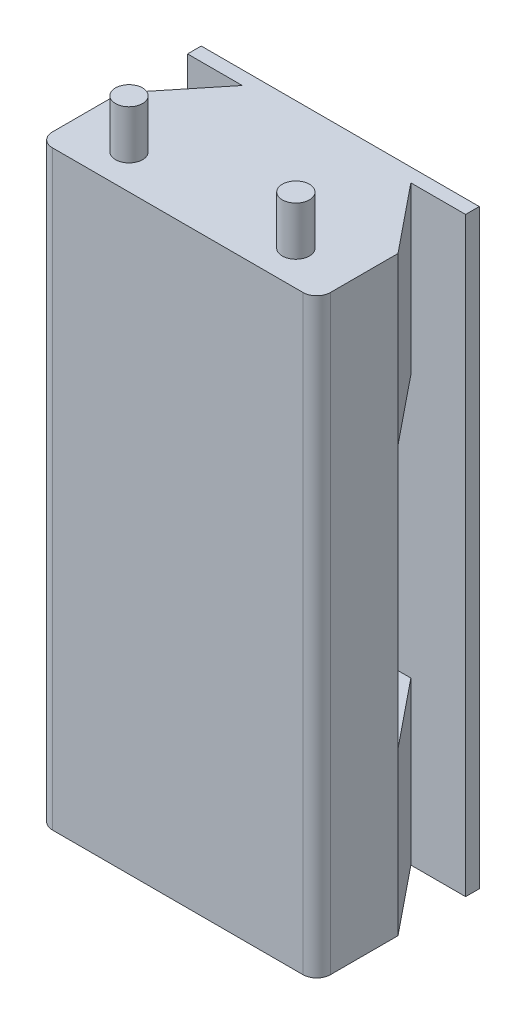
ISO-10303-21;
HEADER;
FILE_DESCRIPTION(('STEP AP214'),'2;1');
FILE_NAME('part.step','',(''),(''),'','','');
FILE_SCHEMA(('AUTOMOTIVE_DESIGN { 1 0 10303 214 1 1 1 1 }'));
ENDSEC;
DATA;
#1=APPLICATION_CONTEXT('core data for automotive mechanical design processes');
#2=APPLICATION_PROTOCOL_DEFINITION('international standard','automotive_design',2000,#1);
#3=PRODUCT_CONTEXT('',#1,'mechanical');
#4=PRODUCT('Part','Part','',(#3));
#5=PRODUCT_RELATED_PRODUCT_CATEGORY('part','',(#4));
#6=PRODUCT_DEFINITION_FORMATION('','',#4);
#7=PRODUCT_DEFINITION_CONTEXT('part definition',#1,'design');
#8=PRODUCT_DEFINITION('design','',#6,#7);
#9=PRODUCT_DEFINITION_SHAPE('','',#8);
#10=(LENGTH_UNIT() NAMED_UNIT(*) SI_UNIT(.MILLI.,.METRE.));
#11=(NAMED_UNIT(*) PLANE_ANGLE_UNIT() SI_UNIT($,.RADIAN.));
#12=(NAMED_UNIT(*) SI_UNIT($,.STERADIAN.) SOLID_ANGLE_UNIT());
#13=UNCERTAINTY_MEASURE_WITH_UNIT(LENGTH_MEASURE(1.E-05),#10,'distance_accuracy_value','');
#14=(GEOMETRIC_REPRESENTATION_CONTEXT(3) GLOBAL_UNCERTAINTY_ASSIGNED_CONTEXT((#13)) GLOBAL_UNIT_ASSIGNED_CONTEXT((#10,
#11,#12)) REPRESENTATION_CONTEXT('',''));
#15=CARTESIAN_POINT('',(0.,0.,0.));
#16=DIRECTION('',(0.,0.,1.));
#17=DIRECTION('',(1.,0.,0.));
#18=AXIS2_PLACEMENT_3D('',#15,#16,#17);
#19=CARTESIAN_POINT('',(56.2,-1.10000000000005,-54.4));
#20=DIRECTION('',(-0.777171592090801,0.,0.629288738535062));
#21=DIRECTION('',(0.629288738535062,0.,0.777171592090801));
#22=AXIS2_PLACEMENT_3D('',#19,#20,#21);
#23=PLANE('',#22);
#24=DIRECTION('',(0.,1.,0.));
#25=VECTOR('',#24,1.);
#26=CARTESIAN_POINT('',(56.2,-1.10000000000005,-54.4));
#27=LINE('',#26,#25);
#28=CARTESIAN_POINT('',(56.2,0.,-54.4));
#29=VERTEX_POINT('',#28);
#30=CARTESIAN_POINT('',(56.2,59.1992915055198,-54.4));
#31=VERTEX_POINT('',#30);
#32=EDGE_CURVE('E320',#29,#31,#27,.T.);
#33=ORIENTED_EDGE('',*,*,#32,.T.);
#34=DIRECTION('',(0.629288738535062,0.,0.777171592090801));
#35=VECTOR('',#34,1.);
#36=CARTESIAN_POINT('',(56.2,59.1992915055198,-54.4));
#37=LINE('',#36,#35);
#38=CARTESIAN_POINT('',(76.2,59.1992915055198,-29.7));
#39=VERTEX_POINT('',#38);
#40=EDGE_CURVE('E236',#31,#39,#37,.T.);
#41=ORIENTED_EDGE('',*,*,#40,.T.);
#42=DIRECTION('',(0.,1.,0.));
#43=VECTOR('',#42,1.);
#44=CARTESIAN_POINT('',(76.2,-1.10000000000005,-29.7));
#45=LINE('',#44,#43);
#46=CARTESIAN_POINT('',(76.2,0.,-29.7));
#47=VERTEX_POINT('',#46);
#48=EDGE_CURVE('E324',#47,#39,#45,.T.);
#49=ORIENTED_EDGE('',*,*,#48,.F.);
#50=DIRECTION('',(0.629288738535062,0.,0.777171592090801));
#51=VECTOR('',#50,1.);
#52=CARTESIAN_POINT('',(60.5497114118544,0.,-49.0281064063598));
#53=LINE('',#52,#51);
#54=EDGE_CURVE('E411',#29,#47,#53,.T.);
#55=ORIENTED_EDGE('',*,*,#54,.F.);
#56=EDGE_LOOP('',(#33,#41,#49,#55));
#57=FACE_BOUND('',#56,.T.);
#58=ADVANCED_FACE('F45',(#57),#23,.F.);
#59=CARTESIAN_POINT('',(-5.4,-1.10000000000005,-54.4));
#60=DIRECTION('',(0.777171592090801,0.,0.629288738535062));
#61=DIRECTION('',(0.629288738535062,0.,-0.777171592090801));
#62=AXIS2_PLACEMENT_3D('',#59,#60,#61);
#63=PLANE('',#62);
#64=DIRECTION('',(0.,1.,0.));
#65=VECTOR('',#64,1.);
#66=CARTESIAN_POINT('',(-25.4,-1.10000000000005,-29.7));
#67=LINE('',#66,#65);
#68=CARTESIAN_POINT('',(-25.4,0.,-29.7));
#69=VERTEX_POINT('',#68);
#70=CARTESIAN_POINT('',(-25.4,62.0129190338137,-29.7));
#71=VERTEX_POINT('',#70);
#72=EDGE_CURVE('E312',#69,#71,#67,.T.);
#73=ORIENTED_EDGE('',*,*,#72,.T.);
#74=DIRECTION('',(0.629288738535062,0.,-0.777171592090801));
#75=VECTOR('',#74,1.);
#76=CARTESIAN_POINT('',(-5.4,62.0129190338137,-54.4));
#77=LINE('',#76,#75);
#78=CARTESIAN_POINT('',(-5.39999999999999,62.0129190338137,-54.4));
#79=VERTEX_POINT('',#78);
#80=EDGE_CURVE('E11',#71,#79,#77,.T.);
#81=ORIENTED_EDGE('',*,*,#80,.T.);
#82=DIRECTION('',(0.,1.,0.));
#83=VECTOR('',#82,1.);
#84=CARTESIAN_POINT('',(-5.4,-1.10000000000005,-54.4));
#85=LINE('',#84,#83);
#86=CARTESIAN_POINT('',(-5.4,0.,-54.4));
#87=VERTEX_POINT('',#86);
#88=EDGE_CURVE('E307',#87,#79,#85,.T.);
#89=ORIENTED_EDGE('',*,*,#88,.F.);
#90=DIRECTION('',(0.629288738535062,0.,-0.777171592090801));
#91=VECTOR('',#90,1.);
#92=CARTESIAN_POINT('',(-29.8667306873645,0.,-24.1835876011048));
#93=LINE('',#92,#91);
#94=EDGE_CURVE('E415',#69,#87,#93,.T.);
#95=ORIENTED_EDGE('',*,*,#94,.F.);
#96=EDGE_LOOP('',(#73,#81,#89,#95));
#97=FACE_BOUND('',#96,.T.);
#98=ADVANCED_FACE('F565',(#97),#63,.F.);
#99=CARTESIAN_POINT('',(71.2,215.9,-5.));
#100=DIRECTION('',(0.,1.,0.));
#101=DIRECTION('',(0.,0.,1.));
#102=AXIS2_PLACEMENT_3D('',#99,#100,#101);
#103=CYLINDRICAL_SURFACE('',#102,5.);
#104=DIRECTION('',(0.,1.,0.));
#105=VECTOR('',#104,1.);
#106=CARTESIAN_POINT('',(71.2,215.9,0.));
#107=LINE('',#106,#105);
#108=CARTESIAN_POINT('',(71.2,0.,0.));
#109=VERTEX_POINT('',#108);
#110=CARTESIAN_POINT('',(71.2,215.9,0.));
#111=VERTEX_POINT('',#110);
#112=EDGE_CURVE('E437',#109,#111,#107,.T.);
#113=ORIENTED_EDGE('',*,*,#112,.F.);
#114=CARTESIAN_POINT('',(71.2,0.,-5.));
#115=DIRECTION('',(0.,1.,0.));
#116=DIRECTION('',(0.,0.,1.));
#117=AXIS2_PLACEMENT_3D('',#114,#115,#116);
#118=CIRCLE('',#117,5.);
#119=CARTESIAN_POINT('',(76.2,0.,-5.));
#120=VERTEX_POINT('',#119);
#121=EDGE_CURVE('E445',#120,#109,#118,.F.);
#122=ORIENTED_EDGE('',*,*,#121,.F.);
#123=DIRECTION('',(0.,1.,0.));
#124=VECTOR('',#123,1.);
#125=CARTESIAN_POINT('',(76.2,215.9,-5.));
#126=LINE('',#125,#124);
#127=CARTESIAN_POINT('',(76.2,215.9,-5.));
#128=VERTEX_POINT('',#127);
#129=EDGE_CURVE('E441',#128,#120,#126,.F.);
#130=ORIENTED_EDGE('',*,*,#129,.F.);
#131=CARTESIAN_POINT('',(71.2,215.9,-5.));
#132=DIRECTION('',(0.,1.,0.));
#133=DIRECTION('',(0.,0.,1.));
#134=AXIS2_PLACEMENT_3D('',#131,#132,#133);
#135=CIRCLE('',#134,5.);
#136=EDGE_CURVE('E448',#111,#128,#135,.T.);
#137=ORIENTED_EDGE('',*,*,#136,.F.);
#138=EDGE_LOOP('',(#113,#122,#130,#137));
#139=FACE_BOUND('',#138,.T.);
#140=ADVANCED_FACE('F47',(#139),#103,.T.);
#141=CARTESIAN_POINT('',(-20.4,215.9,-5.));
#142=DIRECTION('',(0.,1.,0.));
#143=DIRECTION('',(0.,0.,1.));
#144=AXIS2_PLACEMENT_3D('',#141,#142,#143);
#145=CYLINDRICAL_SURFACE('',#144,5.);
#146=DIRECTION('',(0.,1.,0.));
#147=VECTOR('',#146,1.);
#148=CARTESIAN_POINT('',(-25.4,215.9,-5.));
#149=LINE('',#148,#147);
#150=CARTESIAN_POINT('',(-25.4,0.,-5.));
#151=VERTEX_POINT('',#150);
#152=CARTESIAN_POINT('',(-25.4,215.9,-5.));
#153=VERTEX_POINT('',#152);
#154=EDGE_CURVE('E423',#151,#153,#149,.T.);
#155=ORIENTED_EDGE('',*,*,#154,.F.);
#156=CARTESIAN_POINT('',(-20.4,0.,-5.));
#157=DIRECTION('',(0.,1.,0.));
#158=DIRECTION('',(0.,0.,1.));
#159=AXIS2_PLACEMENT_3D('',#156,#157,#158);
#160=CIRCLE('',#159,5.);
#161=CARTESIAN_POINT('',(-20.4,0.,0.));
#162=VERTEX_POINT('',#161);
#163=EDGE_CURVE('E431',#162,#151,#160,.F.);
#164=ORIENTED_EDGE('',*,*,#163,.F.);
#165=DIRECTION('',(0.,1.,0.));
#166=VECTOR('',#165,1.);
#167=CARTESIAN_POINT('',(-20.4,215.9,0.));
#168=LINE('',#167,#166);
#169=CARTESIAN_POINT('',(-20.4,215.9,0.));
#170=VERTEX_POINT('',#169);
#171=EDGE_CURVE('E427',#170,#162,#168,.F.);
#172=ORIENTED_EDGE('',*,*,#171,.F.);
#173=CARTESIAN_POINT('',(-20.4,215.9,-5.));
#174=DIRECTION('',(0.,1.,0.));
#175=DIRECTION('',(0.,0.,1.));
#176=AXIS2_PLACEMENT_3D('',#173,#174,#175);
#177=CIRCLE('',#176,5.);
#178=EDGE_CURVE('E434',#153,#170,#177,.T.);
#179=ORIENTED_EDGE('',*,*,#178,.F.);
#180=EDGE_LOOP('',(#155,#164,#172,#179));
#181=FACE_BOUND('',#180,.T.);
#182=ADVANCED_FACE('F531',(#181),#145,.T.);
#183=CARTESIAN_POINT('',(76.2,215.9,-25.4));
#184=DIRECTION('',(-1.,0.,0.));
#185=DIRECTION('',(0.,0.,1.));
#186=AXIS2_PLACEMENT_3D('',#183,#184,#185);
#187=PLANE('',#186);
#188=DIRECTION('',(0.,0.,-1.));
#189=VECTOR('',#188,1.);
#190=CARTESIAN_POINT('',(76.2,215.9,-25.4));
#191=LINE('',#190,#189);
#192=CARTESIAN_POINT('',(76.2,215.9,-29.7));
#193=VERTEX_POINT('',#192);
#194=EDGE_CURVE('E381',#128,#193,#191,.T.);
#195=ORIENTED_EDGE('',*,*,#194,.F.);
#196=ORIENTED_EDGE('',*,*,#129,.T.);
#197=DIRECTION('',(0.,0.,-1.));
#198=VECTOR('',#197,1.);
#199=CARTESIAN_POINT('',(76.2,0.,-25.4));
#200=LINE('',#199,#198);
#201=EDGE_CURVE('E396',#120,#47,#200,.T.);
#202=ORIENTED_EDGE('',*,*,#201,.T.);
#203=ORIENTED_EDGE('',*,*,#48,.T.);
#204=DIRECTION('',(0.,-1.,0.));
#205=VECTOR('',#204,1.);
#206=CARTESIAN_POINT('',(76.2,155.19929150552,-29.7));
#207=LINE('',#206,#205);
#208=CARTESIAN_POINT('',(76.2,155.19929150552,-29.7));
#209=VERTEX_POINT('',#208);
#210=EDGE_CURVE('E212',#209,#39,#207,.T.);
#211=ORIENTED_EDGE('',*,*,#210,.F.);
#212=EDGE_CURVE('E292',#209,#193,#45,.T.);
#213=ORIENTED_EDGE('',*,*,#212,.T.);
#214=EDGE_LOOP('',(#195,#196,#202,#203,#211,#213));
#215=FACE_BOUND('',#214,.T.);
#216=ADVANCED_FACE('F546',(#215),#187,.F.);
#217=CARTESIAN_POINT('',(-25.4,215.9,0.));
#218=DIRECTION('',(1.,0.,0.));
#219=DIRECTION('',(0.,0.,-1.));
#220=AXIS2_PLACEMENT_3D('',#217,#218,#219);
#221=PLANE('',#220);
#222=DIRECTION('',(0.,0.,1.));
#223=VECTOR('',#222,1.);
#224=CARTESIAN_POINT('',(-25.4,0.,0.));
#225=LINE('',#224,#223);
#226=CARTESIAN_POINT('',(-25.4,0.,-59.4));
#227=VERTEX_POINT('',#226);
#228=CARTESIAN_POINT('',(-25.4,0.,-54.4));
#229=VERTEX_POINT('',#228);
#230=EDGE_CURVE('E400',#227,#229,#225,.T.);
#231=ORIENTED_EDGE('',*,*,#230,.T.);
#232=DIRECTION('',(0.,1.,0.));
#233=VECTOR('',#232,1.);
#234=CARTESIAN_POINT('',(-25.4,-1.10000000000005,-54.4));
#235=LINE('',#234,#233);
#236=CARTESIAN_POINT('',(-25.4,215.9,-54.4));
#237=VERTEX_POINT('',#236);
#238=EDGE_CURVE('E303',#229,#237,#235,.T.);
#239=ORIENTED_EDGE('',*,*,#238,.T.);
#240=DIRECTION('',(0.,0.,1.));
#241=VECTOR('',#240,1.);
#242=CARTESIAN_POINT('',(-25.4,215.9,0.));
#243=LINE('',#242,#241);
#244=CARTESIAN_POINT('',(-25.4,215.9,-59.4));
#245=VERTEX_POINT('',#244);
#246=EDGE_CURVE('E387',#245,#237,#243,.T.);
#247=ORIENTED_EDGE('',*,*,#246,.F.);
#248=DIRECTION('',(0.,1.,0.));
#249=VECTOR('',#248,1.);
#250=CARTESIAN_POINT('',(-25.4,0.,-59.4));
#251=LINE('',#250,#249);
#252=EDGE_CURVE('E340',#227,#245,#251,.T.);
#253=ORIENTED_EDGE('',*,*,#252,.F.);
#254=EDGE_LOOP('',(#231,#239,#247,#253));
#255=FACE_BOUND('',#254,.T.);
#256=ADVANCED_FACE('F514',(#255),#221,.F.);
#257=CARTESIAN_POINT('',(76.2,215.9,-54.4));
#258=VERTEX_POINT('',#257);
#259=CARTESIAN_POINT('',(76.2,215.9,-59.4));
#260=VERTEX_POINT('',#259);
#261=EDGE_CURVE('E386',#258,#260,#191,.T.);
#262=ORIENTED_EDGE('',*,*,#261,.F.);
#263=DIRECTION('',(0.,1.,0.));
#264=VECTOR('',#263,1.);
#265=CARTESIAN_POINT('',(76.2,-1.10000000000005,-54.4));
#266=LINE('',#265,#264);
#267=CARTESIAN_POINT('',(76.2,0.,-54.4));
#268=VERTEX_POINT('',#267);
#269=EDGE_CURVE('E316',#268,#258,#266,.T.);
#270=ORIENTED_EDGE('',*,*,#269,.F.);
#271=CARTESIAN_POINT('',(76.2,0.,-59.4));
#272=VERTEX_POINT('',#271);
#273=EDGE_CURVE('E369',#268,#272,#200,.T.);
#274=ORIENTED_EDGE('',*,*,#273,.T.);
#275=DIRECTION('',(0.,-1.,0.));
#276=VECTOR('',#275,1.);
#277=CARTESIAN_POINT('',(76.2,215.9,-59.4));
#278=LINE('',#277,#276);
#279=EDGE_CURVE('E306',#260,#272,#278,.T.);
#280=ORIENTED_EDGE('',*,*,#279,.F.);
#281=EDGE_LOOP('',(#262,#270,#274,#280));
#282=FACE_BOUND('',#281,.T.);
#283=ADVANCED_FACE('F505',(#282),#187,.F.);
#284=EDGE_CURVE('E399',#69,#151,#225,.T.);
#285=ORIENTED_EDGE('',*,*,#284,.T.);
#286=ORIENTED_EDGE('',*,*,#154,.T.);
#287=CARTESIAN_POINT('',(-25.4,215.9,-29.7));
#288=VERTEX_POINT('',#287);
#289=EDGE_CURVE('E385',#288,#153,#243,.T.);
#290=ORIENTED_EDGE('',*,*,#289,.F.);
#291=CARTESIAN_POINT('',(-25.4,158.012919033814,-29.7));
#292=VERTEX_POINT('',#291);
#293=EDGE_CURVE('E302',#292,#288,#67,.T.);
#294=ORIENTED_EDGE('',*,*,#293,.F.);
#295=DIRECTION('',(0.,1.,0.));
#296=VECTOR('',#295,1.);
#297=CARTESIAN_POINT('',(-25.4,158.012919033814,-29.7));
#298=LINE('',#297,#296);
#299=EDGE_CURVE('E240',#71,#292,#298,.T.);
#300=ORIENTED_EDGE('',*,*,#299,.F.);
#301=ORIENTED_EDGE('',*,*,#72,.F.);
#302=EDGE_LOOP('',(#285,#286,#290,#294,#300,#301));
#303=FACE_BOUND('',#302,.T.);
#304=ADVANCED_FACE('F466',(#303),#221,.F.);
#305=CARTESIAN_POINT('',(-25.4,215.9,0.));
#306=DIRECTION('',(0.,0.,-1.));
#307=DIRECTION('',(-1.,0.,0.));
#308=AXIS2_PLACEMENT_3D('',#305,#306,#307);
#309=PLANE('',#308);
#310=DIRECTION('',(1.,0.,0.));
#311=VECTOR('',#310,1.);
#312=CARTESIAN_POINT('',(-25.4,0.,0.));
#313=LINE('',#312,#311);
#314=EDGE_CURVE('E404',#162,#109,#313,.T.);
#315=ORIENTED_EDGE('',*,*,#314,.T.);
#316=ORIENTED_EDGE('',*,*,#112,.T.);
#317=DIRECTION('',(1.,0.,0.));
#318=VECTOR('',#317,1.);
#319=CARTESIAN_POINT('',(-25.4,215.9,0.));
#320=LINE('',#319,#318);
#321=EDGE_CURVE('E391',#170,#111,#320,.T.);
#322=ORIENTED_EDGE('',*,*,#321,.F.);
#323=ORIENTED_EDGE('',*,*,#171,.T.);
#324=EDGE_LOOP('',(#315,#316,#322,#323));
#325=FACE_BOUND('',#324,.T.);
#326=ADVANCED_FACE('F534',(#325),#309,.F.);
#327=CARTESIAN_POINT('',(0.,215.9,0.));
#328=DIRECTION('',(0.,1.,0.));
#329=DIRECTION('',(0.,0.,1.));
#330=AXIS2_PLACEMENT_3D('',#327,#328,#329);
#331=PLANE('',#330);
#332=ORIENTED_EDGE('',*,*,#321,.T.);
#333=ORIENTED_EDGE('',*,*,#136,.T.);
#334=ORIENTED_EDGE('',*,*,#194,.T.);
#335=DIRECTION('',(0.629288738535062,0.,0.777171592090801));
#336=VECTOR('',#335,1.);
#337=CARTESIAN_POINT('',(56.2,215.9,-54.4));
#338=LINE('',#337,#336);
#339=CARTESIAN_POINT('',(56.2,215.9,-54.4));
#340=VERTEX_POINT('',#339);
#341=EDGE_CURVE('E319',#340,#193,#338,.T.);
#342=ORIENTED_EDGE('',*,*,#341,.F.);
#343=DIRECTION('',(-1.,0.,0.));
#344=VECTOR('',#343,1.);
#345=CARTESIAN_POINT('',(76.2,215.9,-54.4));
#346=LINE('',#345,#344);
#347=EDGE_CURVE('E298',#258,#340,#346,.T.);
#348=ORIENTED_EDGE('',*,*,#347,.F.);
#349=ORIENTED_EDGE('',*,*,#261,.T.);
#350=DIRECTION('',(1.,0.,0.));
#351=VECTOR('',#350,1.);
#352=CARTESIAN_POINT('',(-25.4,215.9,-59.4));
#353=LINE('',#352,#351);
#354=EDGE_CURVE('E344',#245,#260,#353,.T.);
#355=ORIENTED_EDGE('',*,*,#354,.F.);
#356=ORIENTED_EDGE('',*,*,#246,.T.);
#357=DIRECTION('',(-1.,0.,0.));
#358=VECTOR('',#357,1.);
#359=CARTESIAN_POINT('',(-25.4,215.9,-54.4));
#360=LINE('',#359,#358);
#361=CARTESIAN_POINT('',(-5.4,215.9,-54.4));
#362=VERTEX_POINT('',#361);
#363=EDGE_CURVE('E297',#362,#237,#360,.T.);
#364=ORIENTED_EDGE('',*,*,#363,.F.);
#365=DIRECTION('',(0.629288738535062,0.,-0.777171592090801));
#366=VECTOR('',#365,1.);
#367=CARTESIAN_POINT('',(-5.4,215.9,-54.4));
#368=LINE('',#367,#366);
#369=EDGE_CURVE('E293',#288,#362,#368,.T.);
#370=ORIENTED_EDGE('',*,*,#369,.F.);
#371=ORIENTED_EDGE('',*,*,#289,.T.);
#372=ORIENTED_EDGE('',*,*,#178,.T.);
#373=EDGE_LOOP('',(#332,#333,#334,#342,#348,#349,#355,#356,#364,#370,#371,#372));
#374=FACE_BOUND('',#373,.T.);
#375=CARTESIAN_POINT('',(-5.08,215.9,-12.7));
#376=DIRECTION('',(0.,1.,0.));
#377=DIRECTION('',(0.,0.,1.));
#378=AXIS2_PLACEMENT_3D('',#375,#376,#377);
#379=CIRCLE('',#378,4.953);
#380=CARTESIAN_POINT('',(-5.08,215.9,-7.747));
#381=VERTEX_POINT('',#380);
#382=EDGE_CURVE('E354',#381,#381,#379,.T.);
#383=ORIENTED_EDGE('',*,*,#382,.F.);
#384=EDGE_LOOP('',(#383));
#385=FACE_BOUND('',#384,.T.);
#386=CARTESIAN_POINT('',(55.88,215.9,-12.7));
#387=DIRECTION('',(0.,1.,0.));
#388=DIRECTION('',(0.,0.,1.));
#389=AXIS2_PLACEMENT_3D('',#386,#387,#388);
#390=CIRCLE('',#389,4.953);
#391=CARTESIAN_POINT('',(55.88,215.9,-7.74700000000001));
#392=VERTEX_POINT('',#391);
#393=EDGE_CURVE('E358',#392,#392,#390,.T.);
#394=ORIENTED_EDGE('',*,*,#393,.F.);
#395=EDGE_LOOP('',(#394));
#396=FACE_BOUND('',#395,.T.);
#397=ADVANCED_FACE('F516',(#374,#385,#396),#331,.T.);
#398=CARTESIAN_POINT('',(0.,0.,0.));
#399=DIRECTION('',(0.,1.,0.));
#400=DIRECTION('',(0.,0.,1.));
#401=AXIS2_PLACEMENT_3D('',#398,#399,#400);
#402=PLANE('',#401);
#403=CARTESIAN_POINT('',(55.88,0.,-12.7));
#404=DIRECTION('',(0.,-1.,0.));
#405=DIRECTION('',(0.,0.,-1.));
#406=AXIS2_PLACEMENT_3D('',#403,#404,#405);
#407=CIRCLE('',#406,5.20700000000001);
#408=CARTESIAN_POINT('',(55.88,0.,-17.907));
#409=VERTEX_POINT('',#408);
#410=EDGE_CURVE('E370',#409,#409,#407,.T.);
#411=ORIENTED_EDGE('',*,*,#410,.F.);
#412=EDGE_LOOP('',(#411));
#413=FACE_BOUND('',#412,.T.);
#414=CARTESIAN_POINT('',(-5.08,0.,-12.7));
#415=DIRECTION('',(0.,-1.,0.));
#416=DIRECTION('',(0.,0.,-1.));
#417=AXIS2_PLACEMENT_3D('',#414,#415,#416);
#418=CIRCLE('',#417,5.207);
#419=CARTESIAN_POINT('',(-5.08,0.,-17.907));
#420=VERTEX_POINT('',#419);
#421=EDGE_CURVE('E374',#420,#420,#418,.T.);
#422=ORIENTED_EDGE('',*,*,#421,.F.);
#423=EDGE_LOOP('',(#422));
#424=FACE_BOUND('',#423,.T.);
#425=ORIENTED_EDGE('',*,*,#201,.F.);
#426=ORIENTED_EDGE('',*,*,#121,.T.);
#427=ORIENTED_EDGE('',*,*,#314,.F.);
#428=ORIENTED_EDGE('',*,*,#163,.T.);
#429=ORIENTED_EDGE('',*,*,#284,.F.);
#430=ORIENTED_EDGE('',*,*,#94,.T.);
#431=DIRECTION('',(-1.,0.,0.));
#432=VECTOR('',#431,1.);
#433=CARTESIAN_POINT('',(0.,0.,-54.4));
#434=LINE('',#433,#432);
#435=EDGE_CURVE('E419',#87,#229,#434,.T.);
#436=ORIENTED_EDGE('',*,*,#435,.T.);
#437=ORIENTED_EDGE('',*,*,#230,.F.);
#438=DIRECTION('',(-1.,0.,0.));
#439=VECTOR('',#438,1.);
#440=CARTESIAN_POINT('',(76.2,0.,-59.4));
#441=LINE('',#440,#439);
#442=EDGE_CURVE('E336',#272,#227,#441,.T.);
#443=ORIENTED_EDGE('',*,*,#442,.F.);
#444=ORIENTED_EDGE('',*,*,#273,.F.);
#445=DIRECTION('',(-1.,0.,0.));
#446=VECTOR('',#445,1.);
#447=CARTESIAN_POINT('',(0.,0.,-54.4));
#448=LINE('',#447,#446);
#449=EDGE_CURVE('E395',#268,#29,#448,.T.);
#450=ORIENTED_EDGE('',*,*,#449,.T.);
#451=ORIENTED_EDGE('',*,*,#54,.T.);
#452=EDGE_LOOP('',(#425,#426,#427,#428,#429,#430,#436,#437,#443,#444,#450,#451));
#453=FACE_BOUND('',#452,.T.);
#454=ADVANCED_FACE('F511',(#413,#424,#453),#402,.F.);
#455=CARTESIAN_POINT('',(-5.08,17.78,-12.7));
#456=DIRECTION('',(0.,-1.,0.));
#457=DIRECTION('',(0.,0.,-1.));
#458=AXIS2_PLACEMENT_3D('',#455,#456,#457);
#459=CYLINDRICAL_SURFACE('',#458,5.207);
#460=CARTESIAN_POINT('',(-5.08,17.78,-12.7));
#461=DIRECTION('',(0.,-1.,0.));
#462=DIRECTION('',(0.,0.,-1.));
#463=AXIS2_PLACEMENT_3D('',#460,#461,#462);
#464=CIRCLE('',#463,5.207);
#465=CARTESIAN_POINT('',(-5.08,17.78,-17.907));
#466=VERTEX_POINT('',#465);
#467=EDGE_CURVE('E353',#466,#466,#464,.T.);
#468=ORIENTED_EDGE('',*,*,#467,.F.);
#469=EDGE_LOOP('',(#468));
#470=FACE_BOUND('',#469,.T.);
#471=ORIENTED_EDGE('',*,*,#421,.T.);
#472=EDGE_LOOP('',(#471));
#473=FACE_BOUND('',#472,.T.);
#474=ADVANCED_FACE('F806',(#470,#473),#459,.F.);
#475=CARTESIAN_POINT('',(-5.08,17.78,-12.7));
#476=DIRECTION('',(0.,-1.,0.));
#477=DIRECTION('',(0.,0.,-1.));
#478=AXIS2_PLACEMENT_3D('',#475,#476,#477);
#479=PLANE('',#478);
#480=ORIENTED_EDGE('',*,*,#467,.T.);
#481=EDGE_LOOP('',(#480));
#482=FACE_BOUND('',#481,.T.);
#483=ADVANCED_FACE('F797',(#482),#479,.T.);
#484=CARTESIAN_POINT('',(55.88,17.78,-12.7));
#485=DIRECTION('',(0.,-1.,0.));
#486=DIRECTION('',(0.,0.,-1.));
#487=AXIS2_PLACEMENT_3D('',#484,#485,#486);
#488=CYLINDRICAL_SURFACE('',#487,5.20700000000001);
#489=CARTESIAN_POINT('',(55.88,17.78,-12.7));
#490=DIRECTION('',(0.,-1.,0.));
#491=DIRECTION('',(0.,0.,-1.));
#492=AXIS2_PLACEMENT_3D('',#489,#490,#491);
#493=CIRCLE('',#492,5.20700000000001);
#494=CARTESIAN_POINT('',(55.88,17.78,-17.907));
#495=VERTEX_POINT('',#494);
#496=EDGE_CURVE('E365',#495,#495,#493,.T.);
#497=ORIENTED_EDGE('',*,*,#496,.F.);
#498=EDGE_LOOP('',(#497));
#499=FACE_BOUND('',#498,.T.);
#500=ORIENTED_EDGE('',*,*,#410,.T.);
#501=EDGE_LOOP('',(#500));
#502=FACE_BOUND('',#501,.T.);
#503=ADVANCED_FACE('F788',(#499,#502),#488,.F.);
#504=CARTESIAN_POINT('',(55.88,17.78,-12.7));
#505=DIRECTION('',(0.,-1.,0.));
#506=DIRECTION('',(0.,0.,-1.));
#507=AXIS2_PLACEMENT_3D('',#504,#505,#506);
#508=PLANE('',#507);
#509=ORIENTED_EDGE('',*,*,#496,.T.);
#510=EDGE_LOOP('',(#509));
#511=FACE_BOUND('',#510,.T.);
#512=ADVANCED_FACE('F779',(#511),#508,.T.);
#513=CARTESIAN_POINT('',(55.88,233.68,-12.7));
#514=DIRECTION('',(0.,-1.,0.));
#515=DIRECTION('',(0.,0.,-1.));
#516=AXIS2_PLACEMENT_3D('',#513,#514,#515);
#517=CYLINDRICAL_SURFACE('',#516,4.953);
#518=CARTESIAN_POINT('',(55.88,233.68,-12.7));
#519=DIRECTION('',(0.,1.,0.));
#520=DIRECTION('',(0.,0.,1.));
#521=AXIS2_PLACEMENT_3D('',#518,#519,#520);
#522=CIRCLE('',#521,4.953);
#523=CARTESIAN_POINT('',(55.88,233.68,-7.74700000000001));
#524=VERTEX_POINT('',#523);
#525=EDGE_CURVE('E348',#524,#524,#522,.T.);
#526=ORIENTED_EDGE('',*,*,#525,.F.);
#527=EDGE_LOOP('',(#526));
#528=FACE_BOUND('',#527,.T.);
#529=ORIENTED_EDGE('',*,*,#393,.T.);
#530=EDGE_LOOP('',(#529));
#531=FACE_BOUND('',#530,.T.);
#532=ADVANCED_FACE('F770',(#528,#531),#517,.T.);
#533=CARTESIAN_POINT('',(55.88,233.68,-12.7));
#534=DIRECTION('',(0.,1.,0.));
#535=DIRECTION('',(0.,0.,1.));
#536=AXIS2_PLACEMENT_3D('',#533,#534,#535);
#537=PLANE('',#536);
#538=ORIENTED_EDGE('',*,*,#525,.T.);
#539=EDGE_LOOP('',(#538));
#540=FACE_BOUND('',#539,.T.);
#541=ADVANCED_FACE('F761',(#540),#537,.T.);
#542=CARTESIAN_POINT('',(-5.08,233.68,-12.7));
#543=DIRECTION('',(0.,-1.,0.));
#544=DIRECTION('',(0.,0.,-1.));
#545=AXIS2_PLACEMENT_3D('',#542,#543,#544);
#546=CYLINDRICAL_SURFACE('',#545,4.953);
#547=CARTESIAN_POINT('',(-5.08,233.68,-12.7));
#548=DIRECTION('',(0.,1.,0.));
#549=DIRECTION('',(0.,0.,1.));
#550=AXIS2_PLACEMENT_3D('',#547,#548,#549);
#551=CIRCLE('',#550,4.953);
#552=CARTESIAN_POINT('',(-5.08,233.68,-7.747));
#553=VERTEX_POINT('',#552);
#554=EDGE_CURVE('E349',#553,#553,#551,.T.);
#555=ORIENTED_EDGE('',*,*,#554,.F.);
#556=EDGE_LOOP('',(#555));
#557=FACE_BOUND('',#556,.T.);
#558=ORIENTED_EDGE('',*,*,#382,.T.);
#559=EDGE_LOOP('',(#558));
#560=FACE_BOUND('',#559,.T.);
#561=ADVANCED_FACE('F752',(#557,#560),#546,.T.);
#562=CARTESIAN_POINT('',(-5.08,233.68,-12.7));
#563=DIRECTION('',(0.,1.,0.));
#564=DIRECTION('',(0.,0.,1.));
#565=AXIS2_PLACEMENT_3D('',#562,#563,#564);
#566=PLANE('',#565);
#567=ORIENTED_EDGE('',*,*,#554,.T.);
#568=EDGE_LOOP('',(#567));
#569=FACE_BOUND('',#568,.T.);
#570=ADVANCED_FACE('F496',(#569),#566,.T.);
#571=CARTESIAN_POINT('',(0.,0.,-59.4));
#572=DIRECTION('',(0.,0.,-1.));
#573=DIRECTION('',(-1.,0.,0.));
#574=AXIS2_PLACEMENT_3D('',#571,#572,#573);
#575=PLANE('',#574);
#576=CARTESIAN_POINT('',(9.40000028272327,129.695762338146,-59.4));
#577=DIRECTION('',(0.,0.,-1.));
#578=DIRECTION('',(-1.,0.,0.));
#579=AXIS2_PLACEMENT_3D('',#576,#577,#578);
#580=CIRCLE('',#579,3.5);
#581=CARTESIAN_POINT('',(5.90000028272327,129.695762338146,-59.4));
#582=VERTEX_POINT('',#581);
#583=EDGE_CURVE('E281',#582,#582,#580,.T.);
#584=ORIENTED_EDGE('',*,*,#583,.F.);
#585=EDGE_LOOP('',(#584));
#586=FACE_BOUND('',#585,.T.);
#587=CARTESIAN_POINT('',(41.4000002827233,93.6957623381464,-59.4));
#588=DIRECTION('',(0.,0.,-1.));
#589=DIRECTION('',(-1.,0.,0.));
#590=AXIS2_PLACEMENT_3D('',#587,#588,#589);
#591=CIRCLE('',#590,3.5);
#592=CARTESIAN_POINT('',(37.9000002827232,93.6957623381464,-59.4));
#593=VERTEX_POINT('',#592);
#594=EDGE_CURVE('E280',#593,#593,#591,.T.);
#595=ORIENTED_EDGE('',*,*,#594,.F.);
#596=EDGE_LOOP('',(#595));
#597=FACE_BOUND('',#596,.T.);
#598=CARTESIAN_POINT('',(9.40000028272327,93.6957623381464,-59.4));
#599=DIRECTION('',(0.,0.,-1.));
#600=DIRECTION('',(-1.,0.,0.));
#601=AXIS2_PLACEMENT_3D('',#598,#599,#600);
#602=CIRCLE('',#601,3.5);
#603=CARTESIAN_POINT('',(5.90000028272326,93.6957623381464,-59.4));
#604=VERTEX_POINT('',#603);
#605=EDGE_CURVE('E276',#604,#604,#602,.T.);
#606=ORIENTED_EDGE('',*,*,#605,.F.);
#607=EDGE_LOOP('',(#606));
#608=FACE_BOUND('',#607,.T.);
#609=CARTESIAN_POINT('',(41.4000002827233,129.695762338146,-59.4));
#610=DIRECTION('',(0.,0.,-1.));
#611=DIRECTION('',(-1.,0.,0.));
#612=AXIS2_PLACEMENT_3D('',#609,#610,#611);
#613=CIRCLE('',#612,3.5);
#614=CARTESIAN_POINT('',(37.9000002827233,129.695762338146,-59.4));
#615=VERTEX_POINT('',#614);
#616=EDGE_CURVE('E285',#615,#615,#613,.T.);
#617=ORIENTED_EDGE('',*,*,#616,.F.);
#618=EDGE_LOOP('',(#617));
#619=FACE_BOUND('',#618,.T.);
#620=ORIENTED_EDGE('',*,*,#279,.T.);
#621=ORIENTED_EDGE('',*,*,#442,.T.);
#622=ORIENTED_EDGE('',*,*,#252,.T.);
#623=ORIENTED_EDGE('',*,*,#354,.T.);
#624=EDGE_LOOP('',(#620,#621,#622,#623));
#625=FACE_BOUND('',#624,.T.);
#626=ADVANCED_FACE('F493',(#586,#597,#608,#619,#625),#575,.T.);
#627=ORIENTED_EDGE('',*,*,#212,.F.);
#628=DIRECTION('',(-0.629288738535062,0.,-0.777171592090801));
#629=VECTOR('',#628,1.);
#630=CARTESIAN_POINT('',(56.2,155.19929150552,-54.4));
#631=LINE('',#630,#629);
#632=CARTESIAN_POINT('',(56.2,155.19929150552,-54.4));
#633=VERTEX_POINT('',#632);
#634=EDGE_CURVE('E233',#209,#633,#631,.T.);
#635=ORIENTED_EDGE('',*,*,#634,.T.);
#636=EDGE_CURVE('E195',#633,#340,#27,.T.);
#637=ORIENTED_EDGE('',*,*,#636,.T.);
#638=ORIENTED_EDGE('',*,*,#341,.T.);
#639=EDGE_LOOP('',(#627,#635,#637,#638));
#640=FACE_BOUND('',#639,.T.);
#641=ADVANCED_FACE('F482',(#640),#23,.F.);
#642=CARTESIAN_POINT('',(76.2,-1.10000000000005,-54.4));
#643=DIRECTION('',(0.,0.,-1.));
#644=DIRECTION('',(-1.,0.,0.));
#645=AXIS2_PLACEMENT_3D('',#642,#643,#644);
#646=PLANE('',#645);
#647=ORIENTED_EDGE('',*,*,#636,.F.);
#648=DIRECTION('',(1.,0.,0.));
#649=VECTOR('',#648,1.);
#650=CARTESIAN_POINT('',(34.2,155.19929150552,-54.4));
#651=LINE('',#650,#649);
#652=CARTESIAN_POINT('',(34.2,155.19929150552,-54.4));
#653=VERTEX_POINT('',#652);
#654=EDGE_CURVE('E186',#653,#633,#651,.T.);
#655=ORIENTED_EDGE('',*,*,#654,.F.);
#656=DIRECTION('',(0.,1.,0.));
#657=VECTOR('',#656,1.);
#658=CARTESIAN_POINT('',(34.2,59.1992915055198,-54.4));
#659=LINE('',#658,#657);
#660=CARTESIAN_POINT('',(34.2,59.1992915055198,-54.4));
#661=VERTEX_POINT('',#660);
#662=EDGE_CURVE('E192',#661,#653,#659,.T.);
#663=ORIENTED_EDGE('',*,*,#662,.F.);
#664=DIRECTION('',(1.,0.,0.));
#665=VECTOR('',#664,1.);
#666=CARTESIAN_POINT('',(34.2,59.1992915055198,-54.4));
#667=LINE('',#666,#665);
#668=EDGE_CURVE('E221',#661,#31,#667,.T.);
#669=ORIENTED_EDGE('',*,*,#668,.T.);
#670=ORIENTED_EDGE('',*,*,#32,.F.);
#671=ORIENTED_EDGE('',*,*,#449,.F.);
#672=ORIENTED_EDGE('',*,*,#269,.T.);
#673=ORIENTED_EDGE('',*,*,#347,.T.);
#674=EDGE_LOOP('',(#647,#655,#663,#669,#670,#671,#672,#673));
#675=FACE_BOUND('',#674,.T.);
#676=CARTESIAN_POINT('',(41.4000002827233,93.6957623381464,-54.4));
#677=DIRECTION('',(0.,0.,-1.));
#678=DIRECTION('',(0.,1.,0.));
#679=AXIS2_PLACEMENT_3D('',#676,#677,#678);
#680=CIRCLE('',#679,3.5);
#681=CARTESIAN_POINT('',(41.4000002827233,97.1957623381464,-54.4));
#682=VERTEX_POINT('',#681);
#683=EDGE_CURVE('E49',#682,#682,#680,.F.);
#684=ORIENTED_EDGE('',*,*,#683,.F.);
#685=EDGE_LOOP('',(#684));
#686=FACE_BOUND('',#685,.T.);
#687=CARTESIAN_POINT('',(41.4000002827233,129.695762338146,-54.4));
#688=DIRECTION('',(0.,0.,-1.));
#689=DIRECTION('',(0.,1.,0.));
#690=AXIS2_PLACEMENT_3D('',#687,#688,#689);
#691=CIRCLE('',#690,3.5);
#692=CARTESIAN_POINT('',(41.4000002827233,133.195762338146,-54.4));
#693=VERTEX_POINT('',#692);
#694=EDGE_CURVE('E229',#693,#693,#691,.F.);
#695=ORIENTED_EDGE('',*,*,#694,.F.);
#696=EDGE_LOOP('',(#695));
#697=FACE_BOUND('',#696,.T.);
#698=ADVANCED_FACE('F188',(#675,#686,#697),#646,.F.);
#699=CARTESIAN_POINT('',(-25.4,-1.10000000000005,-54.4));
#700=DIRECTION('',(0.,0.,-1.));
#701=DIRECTION('',(-1.,0.,0.));
#702=AXIS2_PLACEMENT_3D('',#699,#700,#701);
#703=PLANE('',#702);
#704=ORIENTED_EDGE('',*,*,#363,.T.);
#705=ORIENTED_EDGE('',*,*,#238,.F.);
#706=ORIENTED_EDGE('',*,*,#435,.F.);
#707=ORIENTED_EDGE('',*,*,#88,.T.);
#708=DIRECTION('',(-1.,0.,0.));
#709=VECTOR('',#708,1.);
#710=CARTESIAN_POINT('',(16.6,62.0129190338137,-54.4));
#711=LINE('',#710,#709);
#712=CARTESIAN_POINT('',(16.6,62.0129190338137,-54.4));
#713=VERTEX_POINT('',#712);
#714=EDGE_CURVE('E259',#713,#79,#711,.T.);
#715=ORIENTED_EDGE('',*,*,#714,.F.);
#716=DIRECTION('',(0.,-1.,0.));
#717=VECTOR('',#716,1.);
#718=CARTESIAN_POINT('',(16.6,158.012919033814,-54.4));
#719=LINE('',#718,#717);
#720=CARTESIAN_POINT('',(16.6,158.012919033814,-54.4));
#721=VERTEX_POINT('',#720);
#722=EDGE_CURVE('E253',#721,#713,#719,.T.);
#723=ORIENTED_EDGE('',*,*,#722,.F.);
#724=DIRECTION('',(-1.,0.,0.));
#725=VECTOR('',#724,1.);
#726=CARTESIAN_POINT('',(16.6,158.012919033814,-54.4));
#727=LINE('',#726,#725);
#728=CARTESIAN_POINT('',(-5.39999999999998,158.012919033814,-54.4));
#729=VERTEX_POINT('',#728);
#730=EDGE_CURVE('E263',#721,#729,#727,.T.);
#731=ORIENTED_EDGE('',*,*,#730,.T.);
#732=EDGE_CURVE('E311',#729,#362,#85,.T.);
#733=ORIENTED_EDGE('',*,*,#732,.T.);
#734=EDGE_LOOP('',(#704,#705,#706,#707,#715,#723,#731,#733));
#735=FACE_BOUND('',#734,.T.);
#736=CARTESIAN_POINT('',(9.40000028272327,129.695762338146,-54.4));
#737=DIRECTION('',(0.,0.,-1.));
#738=DIRECTION('',(0.,1.,0.));
#739=AXIS2_PLACEMENT_3D('',#736,#737,#738);
#740=CIRCLE('',#739,3.5);
#741=CARTESIAN_POINT('',(9.40000028272327,133.195762338146,-54.4));
#742=VERTEX_POINT('',#741);
#743=EDGE_CURVE('E262',#742,#742,#740,.F.);
#744=ORIENTED_EDGE('',*,*,#743,.F.);
#745=EDGE_LOOP('',(#744));
#746=FACE_BOUND('',#745,.T.);
#747=CARTESIAN_POINT('',(9.40000028272327,93.6957623381464,-54.4));
#748=DIRECTION('',(0.,0.,-1.));
#749=DIRECTION('',(0.,1.,0.));
#750=AXIS2_PLACEMENT_3D('',#747,#748,#749);
#751=CIRCLE('',#750,3.5);
#752=CARTESIAN_POINT('',(9.40000028272327,97.1957623381464,-54.4));
#753=VERTEX_POINT('',#752);
#754=EDGE_CURVE('E272',#753,#753,#751,.F.);
#755=ORIENTED_EDGE('',*,*,#754,.F.);
#756=EDGE_LOOP('',(#755));
#757=FACE_BOUND('',#756,.T.);
#758=ADVANCED_FACE('F481',(#735,#746,#757),#703,.F.);
#759=ORIENTED_EDGE('',*,*,#732,.F.);
#760=DIRECTION('',(-0.629288738535062,0.,0.777171592090801));
#761=VECTOR('',#760,1.);
#762=CARTESIAN_POINT('',(-5.4,158.012919033814,-54.4));
#763=LINE('',#762,#761);
#764=EDGE_CURVE('E55',#729,#292,#763,.T.);
#765=ORIENTED_EDGE('',*,*,#764,.T.);
#766=ORIENTED_EDGE('',*,*,#293,.T.);
#767=ORIENTED_EDGE('',*,*,#369,.T.);
#768=EDGE_LOOP('',(#759,#765,#766,#767));
#769=FACE_BOUND('',#768,.T.);
#770=ADVANCED_FACE('F459',(#769),#63,.F.);
#771=CARTESIAN_POINT('',(41.4000002827233,129.695762338146,-50.4));
#772=DIRECTION('',(0.,0.,-1.));
#773=DIRECTION('',(-1.,0.,0.));
#774=AXIS2_PLACEMENT_3D('',#771,#772,#773);
#775=CYLINDRICAL_SURFACE('',#774,3.5);
#776=ORIENTED_EDGE('',*,*,#694,.T.);
#777=EDGE_LOOP('',(#776));
#778=FACE_BOUND('',#777,.T.);
#779=ORIENTED_EDGE('',*,*,#616,.T.);
#780=EDGE_LOOP('',(#779));
#781=FACE_BOUND('',#780,.T.);
#782=ADVANCED_FACE('F486',(#778,#781),#775,.F.);
#783=CARTESIAN_POINT('',(9.40000028272327,93.6957623381464,-50.4));
#784=DIRECTION('',(0.,0.,-1.));
#785=DIRECTION('',(-1.,0.,0.));
#786=AXIS2_PLACEMENT_3D('',#783,#784,#785);
#787=CYLINDRICAL_SURFACE('',#786,3.5);
#788=ORIENTED_EDGE('',*,*,#754,.T.);
#789=EDGE_LOOP('',(#788));
#790=FACE_BOUND('',#789,.T.);
#791=ORIENTED_EDGE('',*,*,#605,.T.);
#792=EDGE_LOOP('',(#791));
#793=FACE_BOUND('',#792,.T.);
#794=ADVANCED_FACE('F489',(#790,#793),#787,.F.);
#795=CARTESIAN_POINT('',(41.4000002827233,93.6957623381464,-50.4));
#796=DIRECTION('',(0.,0.,-1.));
#797=DIRECTION('',(-1.,0.,0.));
#798=AXIS2_PLACEMENT_3D('',#795,#796,#797);
#799=CYLINDRICAL_SURFACE('',#798,3.5);
#800=ORIENTED_EDGE('',*,*,#683,.T.);
#801=EDGE_LOOP('',(#800));
#802=FACE_BOUND('',#801,.T.);
#803=ORIENTED_EDGE('',*,*,#594,.T.);
#804=EDGE_LOOP('',(#803));
#805=FACE_BOUND('',#804,.T.);
#806=ADVANCED_FACE('F477',(#802,#805),#799,.F.);
#807=CARTESIAN_POINT('',(9.40000028272327,129.695762338146,-50.4));
#808=DIRECTION('',(0.,0.,-1.));
#809=DIRECTION('',(-1.,0.,0.));
#810=AXIS2_PLACEMENT_3D('',#807,#808,#809);
#811=CYLINDRICAL_SURFACE('',#810,3.5);
#812=ORIENTED_EDGE('',*,*,#743,.T.);
#813=EDGE_LOOP('',(#812));
#814=FACE_BOUND('',#813,.T.);
#815=ORIENTED_EDGE('',*,*,#583,.T.);
#816=EDGE_LOOP('',(#815));
#817=FACE_BOUND('',#816,.T.);
#818=ADVANCED_FACE('F598',(#814,#817),#811,.F.);
#819=CARTESIAN_POINT('',(16.6,62.0129190338137,-54.4));
#820=DIRECTION('',(0.,-1.,0.));
#821=DIRECTION('',(0.,0.,-1.));
#822=AXIS2_PLACEMENT_3D('',#819,#820,#821);
#823=PLANE('',#822);
#824=DIRECTION('',(-1.,0.,0.));
#825=VECTOR('',#824,1.);
#826=CARTESIAN_POINT('',(16.6,62.0129190338137,-29.7));
#827=LINE('',#826,#825);
#828=CARTESIAN_POINT('',(16.6,62.0129190338137,-29.7));
#829=VERTEX_POINT('',#828);
#830=EDGE_CURVE('E70',#829,#71,#827,.T.);
#831=ORIENTED_EDGE('',*,*,#830,.F.);
#832=DIRECTION('',(0.,0.,1.));
#833=VECTOR('',#832,1.);
#834=CARTESIAN_POINT('',(16.6,62.0129190338137,-54.4));
#835=LINE('',#834,#833);
#836=EDGE_CURVE('E241',#713,#829,#835,.T.);
#837=ORIENTED_EDGE('',*,*,#836,.F.);
#838=ORIENTED_EDGE('',*,*,#714,.T.);
#839=ORIENTED_EDGE('',*,*,#80,.F.);
#840=EDGE_LOOP('',(#831,#837,#838,#839));
#841=FACE_BOUND('',#840,.T.);
#842=ADVANCED_FACE('F614',(#841),#823,.F.);
#843=CARTESIAN_POINT('',(16.6,158.012919033814,-29.7));
#844=DIRECTION('',(0.,1.,0.));
#845=DIRECTION('',(0.,0.,1.));
#846=AXIS2_PLACEMENT_3D('',#843,#844,#845);
#847=PLANE('',#846);
#848=ORIENTED_EDGE('',*,*,#730,.F.);
#849=DIRECTION('',(0.,0.,-1.));
#850=VECTOR('',#849,1.);
#851=CARTESIAN_POINT('',(16.6,158.012919033814,-29.7));
#852=LINE('',#851,#850);
#853=CARTESIAN_POINT('',(16.6,158.012919033814,-29.7));
#854=VERTEX_POINT('',#853);
#855=EDGE_CURVE('E249',#854,#721,#852,.T.);
#856=ORIENTED_EDGE('',*,*,#855,.F.);
#857=DIRECTION('',(-1.,0.,0.));
#858=VECTOR('',#857,1.);
#859=CARTESIAN_POINT('',(16.6,158.012919033814,-29.7));
#860=LINE('',#859,#858);
#861=EDGE_CURVE('E267',#854,#292,#860,.T.);
#862=ORIENTED_EDGE('',*,*,#861,.T.);
#863=ORIENTED_EDGE('',*,*,#764,.F.);
#864=EDGE_LOOP('',(#848,#856,#862,#863));
#865=FACE_BOUND('',#864,.T.);
#866=ADVANCED_FACE('F656',(#865),#847,.F.);
#867=CARTESIAN_POINT('',(16.6,158.012919033814,-29.7));
#868=DIRECTION('',(0.,0.,1.));
#869=DIRECTION('',(0.,-1.,0.));
#870=AXIS2_PLACEMENT_3D('',#867,#868,#869);
#871=PLANE('',#870);
#872=ORIENTED_EDGE('',*,*,#299,.T.);
#873=ORIENTED_EDGE('',*,*,#861,.F.);
#874=DIRECTION('',(0.,1.,0.));
#875=VECTOR('',#874,1.);
#876=CARTESIAN_POINT('',(16.6,158.012919033814,-29.7));
#877=LINE('',#876,#875);
#878=EDGE_CURVE('E245',#829,#854,#877,.T.);
#879=ORIENTED_EDGE('',*,*,#878,.F.);
#880=ORIENTED_EDGE('',*,*,#830,.T.);
#881=EDGE_LOOP('',(#872,#873,#879,#880));
#882=FACE_BOUND('',#881,.T.);
#883=ADVANCED_FACE('F559',(#882),#871,.F.);
#884=CARTESIAN_POINT('',(16.6,0.,0.));
#885=DIRECTION('',(1.,0.,0.));
#886=DIRECTION('',(0.,0.,-1.));
#887=AXIS2_PLACEMENT_3D('',#884,#885,#886);
#888=PLANE('',#887);
#889=ORIENTED_EDGE('',*,*,#836,.T.);
#890=ORIENTED_EDGE('',*,*,#878,.T.);
#891=ORIENTED_EDGE('',*,*,#855,.T.);
#892=ORIENTED_EDGE('',*,*,#722,.T.);
#893=EDGE_LOOP('',(#889,#890,#891,#892));
#894=FACE_BOUND('',#893,.T.);
#895=ADVANCED_FACE('F551',(#894),#888,.F.);
#896=CARTESIAN_POINT('',(34.2,59.1992915055198,-29.7));
#897=DIRECTION('',(0.,-1.,0.));
#898=DIRECTION('',(0.,0.,-1.));
#899=AXIS2_PLACEMENT_3D('',#896,#897,#898);
#900=PLANE('',#899);
#901=ORIENTED_EDGE('',*,*,#668,.F.);
#902=DIRECTION('',(0.,0.,-1.));
#903=VECTOR('',#902,1.);
#904=CARTESIAN_POINT('',(34.2,59.1992915055198,-29.7));
#905=LINE('',#904,#903);
#906=CARTESIAN_POINT('',(34.2,59.1992915055198,-29.7));
#907=VERTEX_POINT('',#906);
#908=EDGE_CURVE('E199',#907,#661,#905,.T.);
#909=ORIENTED_EDGE('',*,*,#908,.F.);
#910=DIRECTION('',(1.,0.,0.));
#911=VECTOR('',#910,1.);
#912=CARTESIAN_POINT('',(34.2,59.1992915055198,-29.7));
#913=LINE('',#912,#911);
#914=EDGE_CURVE('E224',#907,#39,#913,.T.);
#915=ORIENTED_EDGE('',*,*,#914,.T.);
#916=ORIENTED_EDGE('',*,*,#40,.F.);
#917=EDGE_LOOP('',(#901,#909,#915,#916));
#918=FACE_BOUND('',#917,.T.);
#919=ADVANCED_FACE('F549',(#918),#900,.F.);
#920=CARTESIAN_POINT('',(34.2,155.19929150552,-54.4));
#921=DIRECTION('',(0.,1.,0.));
#922=DIRECTION('',(0.,0.,1.));
#923=AXIS2_PLACEMENT_3D('',#920,#921,#922);
#924=PLANE('',#923);
#925=DIRECTION('',(1.,0.,0.));
#926=VECTOR('',#925,1.);
#927=CARTESIAN_POINT('',(34.2,155.19929150552,-29.7));
#928=LINE('',#927,#926);
#929=CARTESIAN_POINT('',(34.2,155.19929150552,-29.7));
#930=VERTEX_POINT('',#929);
#931=EDGE_CURVE('E62',#930,#209,#928,.T.);
#932=ORIENTED_EDGE('',*,*,#931,.F.);
#933=DIRECTION('',(0.,0.,1.));
#934=VECTOR('',#933,1.);
#935=CARTESIAN_POINT('',(34.2,155.19929150552,-54.4));
#936=LINE('',#935,#934);
#937=EDGE_CURVE('E202',#653,#930,#936,.T.);
#938=ORIENTED_EDGE('',*,*,#937,.F.);
#939=ORIENTED_EDGE('',*,*,#654,.T.);
#940=ORIENTED_EDGE('',*,*,#634,.F.);
#941=EDGE_LOOP('',(#932,#938,#939,#940));
#942=FACE_BOUND('',#941,.T.);
#943=ADVANCED_FACE('F203',(#942),#924,.F.);
#944=CARTESIAN_POINT('',(34.2,155.19929150552,-29.7));
#945=DIRECTION('',(0.,0.,1.));
#946=DIRECTION('',(0.,-1.,0.));
#947=AXIS2_PLACEMENT_3D('',#944,#945,#946);
#948=PLANE('',#947);
#949=ORIENTED_EDGE('',*,*,#210,.T.);
#950=ORIENTED_EDGE('',*,*,#914,.F.);
#951=DIRECTION('',(0.,-1.,0.));
#952=VECTOR('',#951,1.);
#953=CARTESIAN_POINT('',(34.2,155.19929150552,-29.7));
#954=LINE('',#953,#952);
#955=EDGE_CURVE('E207',#930,#907,#954,.T.);
#956=ORIENTED_EDGE('',*,*,#955,.F.);
#957=ORIENTED_EDGE('',*,*,#931,.T.);
#958=EDGE_LOOP('',(#949,#950,#956,#957));
#959=FACE_BOUND('',#958,.T.);
#960=ADVANCED_FACE('F547',(#959),#948,.F.);
#961=CARTESIAN_POINT('',(34.2,0.,0.));
#962=DIRECTION('',(1.,0.,0.));
#963=DIRECTION('',(0.,0.,-1.));
#964=AXIS2_PLACEMENT_3D('',#961,#962,#963);
#965=PLANE('',#964);
#966=ORIENTED_EDGE('',*,*,#662,.T.);
#967=ORIENTED_EDGE('',*,*,#937,.T.);
#968=ORIENTED_EDGE('',*,*,#955,.T.);
#969=ORIENTED_EDGE('',*,*,#908,.T.);
#970=EDGE_LOOP('',(#966,#967,#968,#969));
#971=FACE_BOUND('',#970,.T.);
#972=ADVANCED_FACE('F209',(#971),#965,.T.);
#973=CLOSED_SHELL('',(#58,#98,#140,#182,#216,#256,#283,#304,#326,#397,#454,#474,#483,#503,#512,
#532,#541,#561,#570,#626,#641,#698,#758,#770,#782,#794,#806,#818,#842,#866,#883,#895,#919,#943,
#960,#972));
#974=MANIFOLD_SOLID_BREP('B2',#973);
#975=ADVANCED_BREP_SHAPE_REPRESENTATION('',(#18,#974),#14);
#976=SHAPE_DEFINITION_REPRESENTATION(#9,#975);
ENDSEC;
END-ISO-10303-21;
